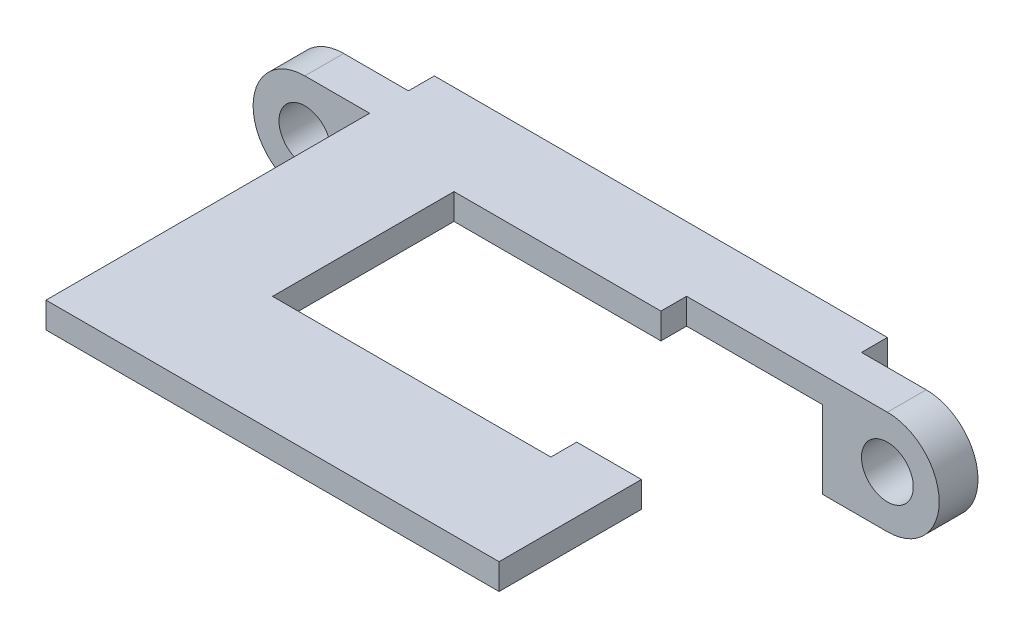
ISO-10303-21;
HEADER;
FILE_DESCRIPTION(('STEP AP214'),'2;1');
FILE_NAME('part.step','',(''),(''),'','','');
FILE_SCHEMA(('AUTOMOTIVE_DESIGN { 1 0 10303 214 1 1 1 1 }'));
ENDSEC;
DATA;
#1=APPLICATION_CONTEXT('core data for automotive mechanical design processes');
#2=APPLICATION_PROTOCOL_DEFINITION('international standard','automotive_design',2000,#1);
#3=PRODUCT_CONTEXT('',#1,'mechanical');
#4=PRODUCT('Part','Part','',(#3));
#5=PRODUCT_RELATED_PRODUCT_CATEGORY('part','',(#4));
#6=PRODUCT_DEFINITION_FORMATION('','',#4);
#7=PRODUCT_DEFINITION_CONTEXT('part definition',#1,'design');
#8=PRODUCT_DEFINITION('design','',#6,#7);
#9=PRODUCT_DEFINITION_SHAPE('','',#8);
#10=(LENGTH_UNIT() NAMED_UNIT(*) SI_UNIT(.MILLI.,.METRE.));
#11=(NAMED_UNIT(*) PLANE_ANGLE_UNIT() SI_UNIT($,.RADIAN.));
#12=(NAMED_UNIT(*) SI_UNIT($,.STERADIAN.) SOLID_ANGLE_UNIT());
#13=UNCERTAINTY_MEASURE_WITH_UNIT(LENGTH_MEASURE(1.E-05),#10,'distance_accuracy_value','');
#14=(GEOMETRIC_REPRESENTATION_CONTEXT(3) GLOBAL_UNCERTAINTY_ASSIGNED_CONTEXT((#13)) GLOBAL_UNIT_ASSIGNED_CONTEXT((#10,
#11,#12)) REPRESENTATION_CONTEXT('',''));
#15=CARTESIAN_POINT('',(0.,0.,0.));
#16=DIRECTION('',(0.,0.,1.));
#17=DIRECTION('',(1.,0.,0.));
#18=AXIS2_PLACEMENT_3D('',#15,#16,#17);
#19=CARTESIAN_POINT('',(-17.5,2.,5.));
#20=DIRECTION('',(1.,0.,0.));
#21=DIRECTION('',(0.,0.,-1.));
#22=AXIS2_PLACEMENT_3D('',#19,#20,#21);
#23=PLANE('',#22);
#24=DIRECTION('',(0.,-1.,0.));
#25=VECTOR('',#24,1.);
#26=CARTESIAN_POINT('',(-17.4999999999841,-291597.9,-13.));
#27=LINE('',#26,#25);
#28=CARTESIAN_POINT('',(-17.4999999999841,2.00000000000955,-13.));
#29=VERTEX_POINT('',#28);
#30=CARTESIAN_POINT('',(-17.4999999999841,0.,-13.));
#31=VERTEX_POINT('',#30);
#32=EDGE_CURVE('E201',#29,#31,#27,.T.);
#33=ORIENTED_EDGE('',*,*,#32,.F.);
#34=DIRECTION('',(0.,0.,1.));
#35=VECTOR('',#34,1.);
#36=CARTESIAN_POINT('',(-17.5,2.,-15.));
#37=LINE('',#36,#35);
#38=CARTESIAN_POINT('',(-17.5,2.,-15.));
#39=VERTEX_POINT('',#38);
#40=EDGE_CURVE('E275',#39,#29,#37,.T.);
#41=ORIENTED_EDGE('',*,*,#40,.F.);
#42=DIRECTION('',(0.,-1.,0.));
#43=VECTOR('',#42,1.);
#44=CARTESIAN_POINT('',(-17.5,2.,-15.));
#45=LINE('',#44,#43);
#46=CARTESIAN_POINT('',(-17.5,0.,-15.));
#47=VERTEX_POINT('',#46);
#48=EDGE_CURVE('E314',#39,#47,#45,.T.);
#49=ORIENTED_EDGE('',*,*,#48,.T.);
#50=DIRECTION('',(0.,0.,1.));
#51=VECTOR('',#50,1.);
#52=CARTESIAN_POINT('',(-17.5,0.,5.));
#53=LINE('',#52,#51);
#54=EDGE_CURVE('E303',#47,#31,#53,.T.);
#55=ORIENTED_EDGE('',*,*,#54,.T.);
#56=EDGE_LOOP('',(#33,#41,#49,#55));
#57=FACE_BOUND('',#56,.T.);
#58=ADVANCED_FACE('F34',(#57),#23,.F.);
#59=CARTESIAN_POINT('',(17.5,2.,6.));
#60=DIRECTION('',(-1.,0.,0.));
#61=DIRECTION('',(0.,0.,1.));
#62=AXIS2_PLACEMENT_3D('',#59,#60,#61);
#63=PLANE('',#62);
#64=DIRECTION('',(0.,0.,-1.));
#65=VECTOR('',#64,1.);
#66=CARTESIAN_POINT('',(17.5,0.,6.));
#67=LINE('',#66,#65);
#68=CARTESIAN_POINT('',(17.5,0.,15.));
#69=VERTEX_POINT('',#68);
#70=CARTESIAN_POINT('',(17.5,0.,4.));
#71=VERTEX_POINT('',#70);
#72=EDGE_CURVE('E250',#69,#71,#67,.T.);
#73=ORIENTED_EDGE('',*,*,#72,.T.);
#74=DIRECTION('',(0.,-1.,0.));
#75=VECTOR('',#74,1.);
#76=CARTESIAN_POINT('',(17.5,2.,4.));
#77=LINE('',#76,#75);
#78=CARTESIAN_POINT('',(17.5,2.,4.));
#79=VERTEX_POINT('',#78);
#80=EDGE_CURVE('E11',#79,#71,#77,.T.);
#81=ORIENTED_EDGE('',*,*,#80,.F.);
#82=DIRECTION('',(0.,0.,-1.));
#83=VECTOR('',#82,1.);
#84=CARTESIAN_POINT('',(17.5,2.,6.));
#85=LINE('',#84,#83);
#86=CARTESIAN_POINT('',(17.5,2.,15.));
#87=VERTEX_POINT('',#86);
#88=EDGE_CURVE('E254',#87,#79,#85,.T.);
#89=ORIENTED_EDGE('',*,*,#88,.F.);
#90=DIRECTION('',(0.,-1.,0.));
#91=VECTOR('',#90,1.);
#92=CARTESIAN_POINT('',(17.5,2.,15.));
#93=LINE('',#92,#91);
#94=EDGE_CURVE('E279',#87,#69,#93,.T.);
#95=ORIENTED_EDGE('',*,*,#94,.T.);
#96=EDGE_LOOP('',(#73,#81,#89,#95));
#97=FACE_BOUND('',#96,.T.);
#98=ADVANCED_FACE('F36',(#97),#63,.F.);
#99=CARTESIAN_POINT('',(17.5,2.,4.));
#100=DIRECTION('',(0.,0.,1.));
#101=DIRECTION('',(1.,0.,0.));
#102=AXIS2_PLACEMENT_3D('',#99,#100,#101);
#103=PLANE('',#102);
#104=DIRECTION('',(-1.,0.,0.));
#105=VECTOR('',#104,1.);
#106=CARTESIAN_POINT('',(17.5,0.,4.));
#107=LINE('',#106,#105);
#108=CARTESIAN_POINT('',(12.5,0.,4.));
#109=VERTEX_POINT('',#108);
#110=EDGE_CURVE('E281',#71,#109,#107,.T.);
#111=ORIENTED_EDGE('',*,*,#110,.T.);
#112=DIRECTION('',(0.,-1.,0.));
#113=VECTOR('',#112,1.);
#114=CARTESIAN_POINT('',(12.5,2.,4.));
#115=LINE('',#114,#113);
#116=CARTESIAN_POINT('',(12.5,2.,4.));
#117=VERTEX_POINT('',#116);
#118=EDGE_CURVE('E42',#117,#109,#115,.T.);
#119=ORIENTED_EDGE('',*,*,#118,.F.);
#120=DIRECTION('',(-1.,0.,0.));
#121=VECTOR('',#120,1.);
#122=CARTESIAN_POINT('',(17.5,2.,4.));
#123=LINE('',#122,#121);
#124=EDGE_CURVE('E256',#79,#117,#123,.T.);
#125=ORIENTED_EDGE('',*,*,#124,.F.);
#126=ORIENTED_EDGE('',*,*,#80,.T.);
#127=EDGE_LOOP('',(#111,#119,#125,#126));
#128=FACE_BOUND('',#127,.T.);
#129=ADVANCED_FACE('F361',(#128),#103,.F.);
#130=CARTESIAN_POINT('',(12.5,2.,4.));
#131=DIRECTION('',(1.,0.,0.));
#132=DIRECTION('',(0.,0.,-1.));
#133=AXIS2_PLACEMENT_3D('',#130,#131,#132);
#134=PLANE('',#133);
#135=DIRECTION('',(0.,0.,1.));
#136=VECTOR('',#135,1.);
#137=CARTESIAN_POINT('',(12.5,0.,4.));
#138=LINE('',#137,#136);
#139=CARTESIAN_POINT('',(12.5,0.,6.));
#140=VERTEX_POINT('',#139);
#141=EDGE_CURVE('E283',#109,#140,#138,.T.);
#142=ORIENTED_EDGE('',*,*,#141,.T.);
#143=DIRECTION('',(0.,-1.,0.));
#144=VECTOR('',#143,1.);
#145=CARTESIAN_POINT('',(12.5,2.,6.));
#146=LINE('',#145,#144);
#147=CARTESIAN_POINT('',(12.5,2.,6.));
#148=VERTEX_POINT('',#147);
#149=EDGE_CURVE('E332',#148,#140,#146,.T.);
#150=ORIENTED_EDGE('',*,*,#149,.F.);
#151=DIRECTION('',(0.,0.,1.));
#152=VECTOR('',#151,1.);
#153=CARTESIAN_POINT('',(12.5,2.,4.));
#154=LINE('',#153,#152);
#155=EDGE_CURVE('E259',#117,#148,#154,.T.);
#156=ORIENTED_EDGE('',*,*,#155,.F.);
#157=ORIENTED_EDGE('',*,*,#118,.T.);
#158=EDGE_LOOP('',(#142,#150,#156,#157));
#159=FACE_BOUND('',#158,.T.);
#160=ADVANCED_FACE('F339',(#159),#134,.F.);
#161=CARTESIAN_POINT('',(-8.99999999999999,2.,6.));
#162=DIRECTION('',(0.,0.,1.));
#163=DIRECTION('',(1.,0.,0.));
#164=AXIS2_PLACEMENT_3D('',#161,#162,#163);
#165=PLANE('',#164);
#166=DIRECTION('',(-1.,0.,0.));
#167=VECTOR('',#166,1.);
#168=CARTESIAN_POINT('',(-8.99999999999999,0.,6.));
#169=LINE('',#168,#167);
#170=CARTESIAN_POINT('',(-8.99999999999999,0.,6.));
#171=VERTEX_POINT('',#170);
#172=EDGE_CURVE('E285',#140,#171,#169,.T.);
#173=ORIENTED_EDGE('',*,*,#172,.T.);
#174=DIRECTION('',(0.,-1.,0.));
#175=VECTOR('',#174,1.);
#176=CARTESIAN_POINT('',(-8.99999999999999,2.,6.));
#177=LINE('',#176,#175);
#178=CARTESIAN_POINT('',(-8.99999999999999,2.,6.));
#179=VERTEX_POINT('',#178);
#180=EDGE_CURVE('E329',#179,#171,#177,.T.);
#181=ORIENTED_EDGE('',*,*,#180,.F.);
#182=DIRECTION('',(-1.,0.,0.));
#183=VECTOR('',#182,1.);
#184=CARTESIAN_POINT('',(-8.99999999999999,2.,6.));
#185=LINE('',#184,#183);
#186=EDGE_CURVE('E261',#148,#179,#185,.T.);
#187=ORIENTED_EDGE('',*,*,#186,.F.);
#188=ORIENTED_EDGE('',*,*,#149,.T.);
#189=EDGE_LOOP('',(#173,#181,#187,#188));
#190=FACE_BOUND('',#189,.T.);
#191=ADVANCED_FACE('F351',(#190),#165,.F.);
#192=CARTESIAN_POINT('',(-9.,2.,-8.01971875506438));
#193=DIRECTION('',(-1.,0.,0.));
#194=DIRECTION('',(0.,0.,1.));
#195=AXIS2_PLACEMENT_3D('',#192,#193,#194);
#196=PLANE('',#195);
#197=DIRECTION('',(0.,0.,-1.));
#198=VECTOR('',#197,1.);
#199=CARTESIAN_POINT('',(-9.,0.,-8.01971875506438));
#200=LINE('',#199,#198);
#201=CARTESIAN_POINT('',(-9.,0.,-8.01971875506438));
#202=VERTEX_POINT('',#201);
#203=EDGE_CURVE('E287',#171,#202,#200,.T.);
#204=ORIENTED_EDGE('',*,*,#203,.T.);
#205=DIRECTION('',(0.,-1.,0.));
#206=VECTOR('',#205,1.);
#207=CARTESIAN_POINT('',(-9.,2.,-8.01971875506438));
#208=LINE('',#207,#206);
#209=CARTESIAN_POINT('',(-9.,2.,-8.01971875506438));
#210=VERTEX_POINT('',#209);
#211=EDGE_CURVE('E326',#210,#202,#208,.T.);
#212=ORIENTED_EDGE('',*,*,#211,.F.);
#213=DIRECTION('',(0.,0.,-1.));
#214=VECTOR('',#213,1.);
#215=CARTESIAN_POINT('',(-9.,2.,-8.01971875506438));
#216=LINE('',#215,#214);
#217=EDGE_CURVE('E263',#179,#210,#216,.T.);
#218=ORIENTED_EDGE('',*,*,#217,.F.);
#219=ORIENTED_EDGE('',*,*,#180,.T.);
#220=EDGE_LOOP('',(#204,#212,#218,#219));
#221=FACE_BOUND('',#220,.T.);
#222=ADVANCED_FACE('F355',(#221),#196,.F.);
#223=CARTESIAN_POINT('',(6.98688159725857,2.,-8.01971875506438));
#224=DIRECTION('',(0.,0.,-1.));
#225=DIRECTION('',(-1.,0.,0.));
#226=AXIS2_PLACEMENT_3D('',#223,#224,#225);
#227=PLANE('',#226);
#228=DIRECTION('',(1.,0.,0.));
#229=VECTOR('',#228,1.);
#230=CARTESIAN_POINT('',(6.98688159725857,0.,-8.01971875506438));
#231=LINE('',#230,#229);
#232=CARTESIAN_POINT('',(6.98688159725857,0.,-8.01971875506438));
#233=VERTEX_POINT('',#232);
#234=EDGE_CURVE('E289',#202,#233,#231,.T.);
#235=ORIENTED_EDGE('',*,*,#234,.T.);
#236=DIRECTION('',(0.,-1.,0.));
#237=VECTOR('',#236,1.);
#238=CARTESIAN_POINT('',(6.98688159725857,2.,-8.01971875506438));
#239=LINE('',#238,#237);
#240=CARTESIAN_POINT('',(6.98688159725857,2.,-8.01971875506438));
#241=VERTEX_POINT('',#240);
#242=EDGE_CURVE('E323',#241,#233,#239,.T.);
#243=ORIENTED_EDGE('',*,*,#242,.F.);
#244=DIRECTION('',(1.,0.,0.));
#245=VECTOR('',#244,1.);
#246=CARTESIAN_POINT('',(6.98688159725857,2.,-8.01971875506438));
#247=LINE('',#246,#245);
#248=EDGE_CURVE('E265',#210,#241,#247,.T.);
#249=ORIENTED_EDGE('',*,*,#248,.F.);
#250=ORIENTED_EDGE('',*,*,#211,.T.);
#251=EDGE_LOOP('',(#235,#243,#249,#250));
#252=FACE_BOUND('',#251,.T.);
#253=ADVANCED_FACE('F410',(#252),#227,.F.);
#254=CARTESIAN_POINT('',(6.98688159725857,2.,-10.));
#255=DIRECTION('',(-1.,0.,0.));
#256=DIRECTION('',(0.,0.,1.));
#257=AXIS2_PLACEMENT_3D('',#254,#255,#256);
#258=PLANE('',#257);
#259=DIRECTION('',(0.,0.,-1.));
#260=VECTOR('',#259,1.);
#261=CARTESIAN_POINT('',(6.98688159725857,0.,-10.));
#262=LINE('',#261,#260);
#263=CARTESIAN_POINT('',(6.98688159725857,0.,-10.));
#264=VERTEX_POINT('',#263);
#265=EDGE_CURVE('E291',#233,#264,#262,.T.);
#266=ORIENTED_EDGE('',*,*,#265,.T.);
#267=DIRECTION('',(0.,-1.,0.));
#268=VECTOR('',#267,1.);
#269=CARTESIAN_POINT('',(6.98688159725857,2.,-10.));
#270=LINE('',#269,#268);
#271=CARTESIAN_POINT('',(6.98688159725857,2.,-10.));
#272=VERTEX_POINT('',#271);
#273=EDGE_CURVE('E320',#272,#264,#270,.T.);
#274=ORIENTED_EDGE('',*,*,#273,.F.);
#275=DIRECTION('',(0.,0.,-1.));
#276=VECTOR('',#275,1.);
#277=CARTESIAN_POINT('',(6.98688159725857,2.,-10.));
#278=LINE('',#277,#276);
#279=EDGE_CURVE('E267',#241,#272,#278,.T.);
#280=ORIENTED_EDGE('',*,*,#279,.F.);
#281=ORIENTED_EDGE('',*,*,#242,.T.);
#282=EDGE_LOOP('',(#266,#274,#280,#281));
#283=FACE_BOUND('',#282,.T.);
#284=ADVANCED_FACE('F407',(#283),#258,.F.);
#285=CARTESIAN_POINT('',(17.5,2.,-10.));
#286=DIRECTION('',(0.,0.,-1.));
#287=DIRECTION('',(-1.,0.,0.));
#288=AXIS2_PLACEMENT_3D('',#285,#286,#287);
#289=PLANE('',#288);
#290=DIRECTION('',(1.,0.,0.));
#291=VECTOR('',#290,1.);
#292=CARTESIAN_POINT('',(17.5,0.,-10.));
#293=LINE('',#292,#291);
#294=CARTESIAN_POINT('',(17.5,0.,-10.));
#295=VERTEX_POINT('',#294);
#296=EDGE_CURVE('E293',#264,#295,#293,.T.);
#297=ORIENTED_EDGE('',*,*,#296,.T.);
#298=DIRECTION('',(0.,1.,0.));
#299=VECTOR('',#298,1.);
#300=CARTESIAN_POINT('',(17.4999999999841,-291597.9,-10.));
#301=LINE('',#300,#299);
#302=CARTESIAN_POINT('',(17.4999999999841,-5.99999999995926,-10.));
#303=VERTEX_POINT('',#302);
#304=EDGE_CURVE('E226',#303,#295,#301,.T.);
#305=ORIENTED_EDGE('',*,*,#304,.F.);
#306=DIRECTION('',(-1.,0.,0.));
#307=VECTOR('',#306,1.);
#308=CARTESIAN_POINT('',(400000.,-6.00000000002865,-10.));
#309=LINE('',#308,#307);
#310=CARTESIAN_POINT('',(22.4999999999795,-5.99999999995926,-10.));
#311=VERTEX_POINT('',#310);
#312=EDGE_CURVE('E233',#311,#303,#309,.T.);
#313=ORIENTED_EDGE('',*,*,#312,.F.);
#314=CARTESIAN_POINT('',(22.5,-2.,-10.));
#315=DIRECTION('',(0.,0.,-1.));
#316=DIRECTION('',(-1.,0.,0.));
#317=AXIS2_PLACEMENT_3D('',#314,#315,#316);
#318=CIRCLE('',#317,4.);
#319=CARTESIAN_POINT('',(22.5000000000364,2.,-10.));
#320=VERTEX_POINT('',#319);
#321=EDGE_CURVE('E229',#320,#311,#318,.T.);
#322=ORIENTED_EDGE('',*,*,#321,.F.);
#323=DIRECTION('',(1.,0.,0.));
#324=VECTOR('',#323,1.);
#325=CARTESIAN_POINT('',(17.5,2.,-10.));
#326=LINE('',#325,#324);
#327=EDGE_CURVE('E269',#272,#320,#326,.T.);
#328=ORIENTED_EDGE('',*,*,#327,.F.);
#329=ORIENTED_EDGE('',*,*,#273,.T.);
#330=EDGE_LOOP('',(#297,#305,#313,#322,#328,#329));
#331=FACE_BOUND('',#330,.T.);
#332=CARTESIAN_POINT('',(22.5,-2.,-10.));
#333=DIRECTION('',(0.,0.,-1.));
#334=DIRECTION('',(-1.,0.,0.));
#335=AXIS2_PLACEMENT_3D('',#332,#333,#334);
#336=CIRCLE('',#335,2.);
#337=CARTESIAN_POINT('',(20.5,-2.,-10.));
#338=VERTEX_POINT('',#337);
#339=EDGE_CURVE('E220',#338,#338,#336,.T.);
#340=ORIENTED_EDGE('',*,*,#339,.T.);
#341=EDGE_LOOP('',(#340));
#342=FACE_BOUND('',#341,.T.);
#343=ADVANCED_FACE('F400',(#331,#342),#289,.F.);
#344=CARTESIAN_POINT('',(17.5,2.,-15.));
#345=DIRECTION('',(-1.,0.,0.));
#346=DIRECTION('',(0.,0.,1.));
#347=AXIS2_PLACEMENT_3D('',#344,#345,#346);
#348=PLANE('',#347);
#349=DIRECTION('',(0.,0.,-1.));
#350=VECTOR('',#349,1.);
#351=CARTESIAN_POINT('',(17.5,2.,-15.));
#352=LINE('',#351,#350);
#353=CARTESIAN_POINT('',(17.5,2.,-13.));
#354=VERTEX_POINT('',#353);
#355=CARTESIAN_POINT('',(17.5,2.,-15.));
#356=VERTEX_POINT('',#355);
#357=EDGE_CURVE('E57',#354,#356,#352,.T.);
#358=ORIENTED_EDGE('',*,*,#357,.F.);
#359=DIRECTION('',(0.,1.,0.));
#360=VECTOR('',#359,1.);
#361=CARTESIAN_POINT('',(17.4999999999841,-291597.9,-13.));
#362=LINE('',#361,#360);
#363=CARTESIAN_POINT('',(17.4999999999841,0.,-13.));
#364=VERTEX_POINT('',#363);
#365=EDGE_CURVE('E223',#364,#354,#362,.T.);
#366=ORIENTED_EDGE('',*,*,#365,.F.);
#367=DIRECTION('',(0.,0.,-1.));
#368=VECTOR('',#367,1.);
#369=CARTESIAN_POINT('',(17.5,0.,-15.));
#370=LINE('',#369,#368);
#371=CARTESIAN_POINT('',(17.5,0.,-15.));
#372=VERTEX_POINT('',#371);
#373=EDGE_CURVE('E295',#364,#372,#370,.T.);
#374=ORIENTED_EDGE('',*,*,#373,.T.);
#375=DIRECTION('',(0.,-1.,0.));
#376=VECTOR('',#375,1.);
#377=CARTESIAN_POINT('',(17.5,2.,-15.));
#378=LINE('',#377,#376);
#379=EDGE_CURVE('E317',#356,#372,#378,.T.);
#380=ORIENTED_EDGE('',*,*,#379,.F.);
#381=EDGE_LOOP('',(#358,#366,#374,#380));
#382=FACE_BOUND('',#381,.T.);
#383=ADVANCED_FACE('F386',(#382),#348,.F.);
#384=CARTESIAN_POINT('',(-17.5,2.,-15.));
#385=DIRECTION('',(0.,0.,1.));
#386=DIRECTION('',(1.,0.,0.));
#387=AXIS2_PLACEMENT_3D('',#384,#385,#386);
#388=PLANE('',#387);
#389=DIRECTION('',(-1.,0.,0.));
#390=VECTOR('',#389,1.);
#391=CARTESIAN_POINT('',(-17.5,0.,-15.));
#392=LINE('',#391,#390);
#393=EDGE_CURVE('E299',#372,#47,#392,.T.);
#394=ORIENTED_EDGE('',*,*,#393,.T.);
#395=ORIENTED_EDGE('',*,*,#48,.F.);
#396=DIRECTION('',(-1.,0.,0.));
#397=VECTOR('',#396,1.);
#398=CARTESIAN_POINT('',(5.,2.,-15.));
#399=LINE('',#398,#397);
#400=EDGE_CURVE('E272',#356,#39,#399,.T.);
#401=ORIENTED_EDGE('',*,*,#400,.F.);
#402=ORIENTED_EDGE('',*,*,#379,.T.);
#403=EDGE_LOOP('',(#394,#395,#401,#402));
#404=FACE_BOUND('',#403,.T.);
#405=ADVANCED_FACE('F383',(#404),#388,.F.);
#406=CARTESIAN_POINT('',(-17.4999999999841,2.00000000000955,-10.));
#407=VERTEX_POINT('',#406);
#408=CARTESIAN_POINT('',(-17.5,2.,15.));
#409=VERTEX_POINT('',#408);
#410=EDGE_CURVE('E274',#407,#409,#37,.T.);
#411=ORIENTED_EDGE('',*,*,#410,.F.);
#412=DIRECTION('',(0.,-1.,0.));
#413=VECTOR('',#412,1.);
#414=CARTESIAN_POINT('',(-17.4999999999841,-291597.9,-10.));
#415=LINE('',#414,#413);
#416=CARTESIAN_POINT('',(-17.5,0.,-10.));
#417=VERTEX_POINT('',#416);
#418=EDGE_CURVE('E194',#407,#417,#415,.T.);
#419=ORIENTED_EDGE('',*,*,#418,.T.);
#420=CARTESIAN_POINT('',(-17.5,0.,15.));
#421=VERTEX_POINT('',#420);
#422=EDGE_CURVE('E302',#417,#421,#53,.T.);
#423=ORIENTED_EDGE('',*,*,#422,.T.);
#424=DIRECTION('',(0.,-1.,0.));
#425=VECTOR('',#424,1.);
#426=CARTESIAN_POINT('',(-17.5,2.,15.));
#427=LINE('',#426,#425);
#428=EDGE_CURVE('E311',#409,#421,#427,.T.);
#429=ORIENTED_EDGE('',*,*,#428,.F.);
#430=EDGE_LOOP('',(#411,#419,#423,#429));
#431=FACE_BOUND('',#430,.T.);
#432=ADVANCED_FACE('F371',(#431),#23,.F.);
#433=CARTESIAN_POINT('',(-17.5,2.,15.));
#434=DIRECTION('',(0.,0.,-1.));
#435=DIRECTION('',(-1.,0.,0.));
#436=AXIS2_PLACEMENT_3D('',#433,#434,#435);
#437=PLANE('',#436);
#438=DIRECTION('',(1.,0.,0.));
#439=VECTOR('',#438,1.);
#440=CARTESIAN_POINT('',(-17.5,0.,15.));
#441=LINE('',#440,#439);
#442=EDGE_CURVE('E257',#421,#69,#441,.T.);
#443=ORIENTED_EDGE('',*,*,#442,.T.);
#444=ORIENTED_EDGE('',*,*,#94,.F.);
#445=DIRECTION('',(1.,0.,0.));
#446=VECTOR('',#445,1.);
#447=CARTESIAN_POINT('',(-17.5,2.,15.));
#448=LINE('',#447,#446);
#449=EDGE_CURVE('E277',#409,#87,#448,.T.);
#450=ORIENTED_EDGE('',*,*,#449,.F.);
#451=ORIENTED_EDGE('',*,*,#428,.T.);
#452=EDGE_LOOP('',(#443,#444,#450,#451));
#453=FACE_BOUND('',#452,.T.);
#454=ADVANCED_FACE('F367',(#453),#437,.F.);
#455=CARTESIAN_POINT('',(0.,2.,0.));
#456=DIRECTION('',(0.,1.,0.));
#457=DIRECTION('',(0.,0.,1.));
#458=AXIS2_PLACEMENT_3D('',#455,#456,#457);
#459=PLANE('',#458);
#460=ORIENTED_EDGE('',*,*,#88,.T.);
#461=ORIENTED_EDGE('',*,*,#124,.T.);
#462=ORIENTED_EDGE('',*,*,#155,.T.);
#463=ORIENTED_EDGE('',*,*,#186,.T.);
#464=ORIENTED_EDGE('',*,*,#217,.T.);
#465=ORIENTED_EDGE('',*,*,#248,.T.);
#466=ORIENTED_EDGE('',*,*,#279,.T.);
#467=ORIENTED_EDGE('',*,*,#327,.T.);
#468=DIRECTION('',(0.,0.,-1.));
#469=VECTOR('',#468,1.);
#470=CARTESIAN_POINT('',(22.5000000000364,2.,-10.));
#471=LINE('',#470,#469);
#472=CARTESIAN_POINT('',(22.5000000000364,2.,-13.));
#473=VERTEX_POINT('',#472);
#474=EDGE_CURVE('E236',#320,#473,#471,.T.);
#475=ORIENTED_EDGE('',*,*,#474,.T.);
#476=DIRECTION('',(1.,0.,0.));
#477=VECTOR('',#476,1.);
#478=CARTESIAN_POINT('',(400000.,1.99999999995271,-13.));
#479=LINE('',#478,#477);
#480=EDGE_CURVE('E240',#354,#473,#479,.T.);
#481=ORIENTED_EDGE('',*,*,#480,.F.);
#482=ORIENTED_EDGE('',*,*,#357,.T.);
#483=ORIENTED_EDGE('',*,*,#400,.T.);
#484=ORIENTED_EDGE('',*,*,#40,.T.);
#485=DIRECTION('',(1.,0.,0.));
#486=VECTOR('',#485,1.);
#487=CARTESIAN_POINT('',(400000.000000001,1.99999999932743,-13.));
#488=LINE('',#487,#486);
#489=CARTESIAN_POINT('',(-22.4999999999795,2.00000000002136,-13.));
#490=VERTEX_POINT('',#489);
#491=EDGE_CURVE('E181',#490,#29,#488,.T.);
#492=ORIENTED_EDGE('',*,*,#491,.F.);
#493=DIRECTION('',(0.,0.,-1.));
#494=VECTOR('',#493,1.);
#495=CARTESIAN_POINT('',(-22.4999999999795,2.00000000002136,-10.));
#496=LINE('',#495,#494);
#497=CARTESIAN_POINT('',(-22.4999999999795,2.00000000002136,-10.));
#498=VERTEX_POINT('',#497);
#499=EDGE_CURVE('E175',#498,#490,#496,.T.);
#500=ORIENTED_EDGE('',*,*,#499,.F.);
#501=DIRECTION('',(1.,0.,0.));
#502=VECTOR('',#501,1.);
#503=CARTESIAN_POINT('',(400000.000000001,1.99999999932743,-10.));
#504=LINE('',#503,#502);
#505=EDGE_CURVE('E178',#498,#407,#504,.T.);
#506=ORIENTED_EDGE('',*,*,#505,.T.);
#507=ORIENTED_EDGE('',*,*,#410,.T.);
#508=ORIENTED_EDGE('',*,*,#449,.T.);
#509=EDGE_LOOP('',(#460,#461,#462,#463,#464,#465,#466,#467,#475,#481,#482,#483,#484,#492,#500,
#506,#507,#508));
#510=FACE_BOUND('',#509,.T.);
#511=ADVANCED_FACE('F177',(#510),#459,.T.);
#512=CARTESIAN_POINT('',(0.,0.,0.));
#513=DIRECTION('',(0.,1.,0.));
#514=DIRECTION('',(0.,0.,1.));
#515=AXIS2_PLACEMENT_3D('',#512,#513,#514);
#516=PLANE('',#515);
#517=ORIENTED_EDGE('',*,*,#72,.F.);
#518=ORIENTED_EDGE('',*,*,#442,.F.);
#519=ORIENTED_EDGE('',*,*,#422,.F.);
#520=EDGE_CURVE('E306',#31,#417,#53,.T.);
#521=ORIENTED_EDGE('',*,*,#520,.F.);
#522=ORIENTED_EDGE('',*,*,#54,.F.);
#523=ORIENTED_EDGE('',*,*,#393,.F.);
#524=ORIENTED_EDGE('',*,*,#373,.F.);
#525=EDGE_CURVE('E296',#295,#364,#370,.T.);
#526=ORIENTED_EDGE('',*,*,#525,.F.);
#527=ORIENTED_EDGE('',*,*,#296,.F.);
#528=ORIENTED_EDGE('',*,*,#265,.F.);
#529=ORIENTED_EDGE('',*,*,#234,.F.);
#530=ORIENTED_EDGE('',*,*,#203,.F.);
#531=ORIENTED_EDGE('',*,*,#172,.F.);
#532=ORIENTED_EDGE('',*,*,#141,.F.);
#533=ORIENTED_EDGE('',*,*,#110,.F.);
#534=EDGE_LOOP('',(#517,#518,#519,#521,#522,#523,#524,#526,#527,#528,#529,#530,#531,#532,#533));
#535=FACE_BOUND('',#534,.T.);
#536=ADVANCED_FACE('F346',(#535),#516,.F.);
#537=CARTESIAN_POINT('',(17.4999999999841,-291597.9,-10.));
#538=DIRECTION('',(-1.,0.,0.));
#539=DIRECTION('',(0.,0.,1.));
#540=AXIS2_PLACEMENT_3D('',#537,#538,#539);
#541=PLANE('',#540);
#542=ORIENTED_EDGE('',*,*,#525,.T.);
#543=CARTESIAN_POINT('',(17.4999999999841,-5.99999999995926,-13.));
#544=VERTEX_POINT('',#543);
#545=EDGE_CURVE('E237',#544,#364,#362,.T.);
#546=ORIENTED_EDGE('',*,*,#545,.F.);
#547=DIRECTION('',(0.,0.,-1.));
#548=VECTOR('',#547,1.);
#549=CARTESIAN_POINT('',(17.4999999999841,-5.99999999995926,-10.));
#550=LINE('',#549,#548);
#551=EDGE_CURVE('E248',#303,#544,#550,.T.);
#552=ORIENTED_EDGE('',*,*,#551,.F.);
#553=ORIENTED_EDGE('',*,*,#304,.T.);
#554=EDGE_LOOP('',(#542,#546,#552,#553));
#555=FACE_BOUND('',#554,.T.);
#556=ADVANCED_FACE('F391',(#555),#541,.T.);
#557=CARTESIAN_POINT('',(400000.,-6.00000000002865,-10.));
#558=DIRECTION('',(0.,-1.,0.));
#559=DIRECTION('',(1.,0.,0.));
#560=AXIS2_PLACEMENT_3D('',#557,#558,#559);
#561=PLANE('',#560);
#562=DIRECTION('',(-1.,0.,0.));
#563=VECTOR('',#562,1.);
#564=CARTESIAN_POINT('',(400000.,-6.00000000002865,-13.));
#565=LINE('',#564,#563);
#566=CARTESIAN_POINT('',(22.4999999999795,-5.99999999995926,-13.));
#567=VERTEX_POINT('',#566);
#568=EDGE_CURVE('E230',#567,#544,#565,.T.);
#569=ORIENTED_EDGE('',*,*,#568,.F.);
#570=DIRECTION('',(0.,0.,-1.));
#571=VECTOR('',#570,1.);
#572=CARTESIAN_POINT('',(22.4999999999795,-5.99999999995926,-10.));
#573=LINE('',#572,#571);
#574=EDGE_CURVE('E251',#311,#567,#573,.T.);
#575=ORIENTED_EDGE('',*,*,#574,.F.);
#576=ORIENTED_EDGE('',*,*,#312,.T.);
#577=ORIENTED_EDGE('',*,*,#551,.T.);
#578=EDGE_LOOP('',(#569,#575,#576,#577));
#579=FACE_BOUND('',#578,.T.);
#580=ADVANCED_FACE('F397',(#579),#561,.T.);
#581=CARTESIAN_POINT('',(22.5,-2.,-10.));
#582=DIRECTION('',(0.,0.,-1.));
#583=DIRECTION('',(-1.,0.,0.));
#584=AXIS2_PLACEMENT_3D('',#581,#582,#583);
#585=CYLINDRICAL_SURFACE('',#584,4.);
#586=CARTESIAN_POINT('',(22.5,-2.,-13.));
#587=DIRECTION('',(0.,0.,-1.));
#588=DIRECTION('',(-1.,0.,0.));
#589=AXIS2_PLACEMENT_3D('',#586,#587,#588);
#590=CIRCLE('',#589,4.);
#591=EDGE_CURVE('E243',#473,#567,#590,.T.);
#592=ORIENTED_EDGE('',*,*,#591,.F.);
#593=ORIENTED_EDGE('',*,*,#474,.F.);
#594=ORIENTED_EDGE('',*,*,#321,.T.);
#595=ORIENTED_EDGE('',*,*,#574,.T.);
#596=EDGE_LOOP('',(#592,#593,#594,#595));
#597=FACE_BOUND('',#596,.T.);
#598=ADVANCED_FACE('F489',(#597),#585,.T.);
#599=CARTESIAN_POINT('',(22.5,-2.,-13.));
#600=DIRECTION('',(0.,0.,-1.));
#601=DIRECTION('',(-1.,0.,0.));
#602=AXIS2_PLACEMENT_3D('',#599,#600,#601);
#603=PLANE('',#602);
#604=CARTESIAN_POINT('',(22.5,-2.,-13.));
#605=DIRECTION('',(0.,0.,-1.));
#606=DIRECTION('',(-1.,0.,0.));
#607=AXIS2_PLACEMENT_3D('',#604,#605,#606);
#608=CIRCLE('',#607,2.);
#609=CARTESIAN_POINT('',(20.5,-2.,-13.));
#610=VERTEX_POINT('',#609);
#611=EDGE_CURVE('E217',#610,#610,#608,.T.);
#612=ORIENTED_EDGE('',*,*,#611,.F.);
#613=EDGE_LOOP('',(#612));
#614=FACE_BOUND('',#613,.T.);
#615=ORIENTED_EDGE('',*,*,#545,.T.);
#616=ORIENTED_EDGE('',*,*,#365,.T.);
#617=ORIENTED_EDGE('',*,*,#480,.T.);
#618=ORIENTED_EDGE('',*,*,#591,.T.);
#619=ORIENTED_EDGE('',*,*,#568,.T.);
#620=EDGE_LOOP('',(#615,#616,#617,#618,#619));
#621=FACE_BOUND('',#620,.T.);
#622=ADVANCED_FACE('F393',(#614,#621),#603,.T.);
#623=CARTESIAN_POINT('',(22.5,-2.,-10.));
#624=DIRECTION('',(0.,0.,-1.));
#625=DIRECTION('',(-1.,0.,0.));
#626=AXIS2_PLACEMENT_3D('',#623,#624,#625);
#627=CYLINDRICAL_SURFACE('',#626,2.);
#628=ORIENTED_EDGE('',*,*,#339,.F.);
#629=EDGE_LOOP('',(#628));
#630=FACE_BOUND('',#629,.T.);
#631=ORIENTED_EDGE('',*,*,#611,.T.);
#632=EDGE_LOOP('',(#631));
#633=FACE_BOUND('',#632,.T.);
#634=ADVANCED_FACE('F507',(#630,#633),#627,.F.);
#635=CARTESIAN_POINT('',(-22.5,-1.99999999999999,-10.));
#636=DIRECTION('',(0.,0.,-1.));
#637=DIRECTION('',(-1.,0.,0.));
#638=AXIS2_PLACEMENT_3D('',#635,#636,#637);
#639=CYLINDRICAL_SURFACE('',#638,4.);
#640=CARTESIAN_POINT('',(-22.5,-1.99999999999999,-13.));
#641=DIRECTION('',(0.,0.,-1.));
#642=DIRECTION('',(-1.,0.,0.));
#643=AXIS2_PLACEMENT_3D('',#640,#641,#642);
#644=CIRCLE('',#643,4.);
#645=CARTESIAN_POINT('',(-22.4999999999795,-5.99999999994671,-13.));
#646=VERTEX_POINT('',#645);
#647=EDGE_CURVE('E209',#646,#490,#644,.T.);
#648=ORIENTED_EDGE('',*,*,#647,.F.);
#649=DIRECTION('',(0.,0.,-1.));
#650=VECTOR('',#649,1.);
#651=CARTESIAN_POINT('',(-22.4999999999795,-5.99999999994671,-10.));
#652=LINE('',#651,#650);
#653=CARTESIAN_POINT('',(-22.4999999999795,-5.99999999994671,-10.));
#654=VERTEX_POINT('',#653);
#655=EDGE_CURVE('E197',#654,#646,#652,.T.);
#656=ORIENTED_EDGE('',*,*,#655,.F.);
#657=CARTESIAN_POINT('',(-22.5,-1.99999999999999,-10.));
#658=DIRECTION('',(0.,0.,-1.));
#659=DIRECTION('',(-1.,0.,0.));
#660=AXIS2_PLACEMENT_3D('',#657,#658,#659);
#661=CIRCLE('',#660,4.);
#662=EDGE_CURVE('E191',#654,#498,#661,.T.);
#663=ORIENTED_EDGE('',*,*,#662,.T.);
#664=ORIENTED_EDGE('',*,*,#499,.T.);
#665=EDGE_LOOP('',(#648,#656,#663,#664));
#666=FACE_BOUND('',#665,.T.);
#667=ADVANCED_FACE('F196',(#666),#639,.T.);
#668=CARTESIAN_POINT('',(400000.,-6.00000000008549,-10.));
#669=DIRECTION('',(0.,-1.,0.));
#670=DIRECTION('',(1.,0.,0.));
#671=AXIS2_PLACEMENT_3D('',#668,#669,#670);
#672=PLANE('',#671);
#673=DIRECTION('',(-1.,0.,0.));
#674=VECTOR('',#673,1.);
#675=CARTESIAN_POINT('',(400000.,-6.00000000008549,-13.));
#676=LINE('',#675,#674);
#677=CARTESIAN_POINT('',(-17.4999999999841,-5.99999999994671,-13.));
#678=VERTEX_POINT('',#677);
#679=EDGE_CURVE('E198',#678,#646,#676,.T.);
#680=ORIENTED_EDGE('',*,*,#679,.F.);
#681=DIRECTION('',(0.,0.,-1.));
#682=VECTOR('',#681,1.);
#683=CARTESIAN_POINT('',(-17.4999999999841,-5.99999999994671,-10.));
#684=LINE('',#683,#682);
#685=CARTESIAN_POINT('',(-17.4999999999841,-5.99999999994671,-10.));
#686=VERTEX_POINT('',#685);
#687=EDGE_CURVE('E186',#686,#678,#684,.T.);
#688=ORIENTED_EDGE('',*,*,#687,.F.);
#689=DIRECTION('',(-1.,0.,0.));
#690=VECTOR('',#689,1.);
#691=CARTESIAN_POINT('',(400000.,-6.00000000008549,-10.));
#692=LINE('',#691,#690);
#693=EDGE_CURVE('E187',#686,#654,#692,.T.);
#694=ORIENTED_EDGE('',*,*,#693,.T.);
#695=ORIENTED_EDGE('',*,*,#655,.T.);
#696=EDGE_LOOP('',(#680,#688,#694,#695));
#697=FACE_BOUND('',#696,.T.);
#698=ADVANCED_FACE('F526',(#697),#672,.T.);
#699=CARTESIAN_POINT('',(-17.4999999999841,-291597.9,-10.));
#700=DIRECTION('',(1.,0.,0.));
#701=DIRECTION('',(0.,0.,-1.));
#702=AXIS2_PLACEMENT_3D('',#699,#700,#701);
#703=PLANE('',#702);
#704=EDGE_CURVE('E213',#31,#678,#27,.T.);
#705=ORIENTED_EDGE('',*,*,#704,.F.);
#706=ORIENTED_EDGE('',*,*,#520,.T.);
#707=EDGE_CURVE('E49',#417,#686,#415,.T.);
#708=ORIENTED_EDGE('',*,*,#707,.T.);
#709=ORIENTED_EDGE('',*,*,#687,.T.);
#710=EDGE_LOOP('',(#705,#706,#708,#709));
#711=FACE_BOUND('',#710,.T.);
#712=ADVANCED_FACE('F374',(#711),#703,.T.);
#713=CARTESIAN_POINT('',(-22.5,-1.99999999999999,-10.));
#714=DIRECTION('',(0.,0.,-1.));
#715=DIRECTION('',(-1.,0.,0.));
#716=AXIS2_PLACEMENT_3D('',#713,#714,#715);
#717=PLANE('',#716);
#718=CARTESIAN_POINT('',(-22.5,-1.99999999999999,-10.));
#719=DIRECTION('',(0.,0.,-1.));
#720=DIRECTION('',(-1.,0.,0.));
#721=AXIS2_PLACEMENT_3D('',#718,#719,#720);
#722=CIRCLE('',#721,2.);
#723=CARTESIAN_POINT('',(-24.5,-1.99999999999999,-10.));
#724=VERTEX_POINT('',#723);
#725=EDGE_CURVE('E211',#724,#724,#722,.T.);
#726=ORIENTED_EDGE('',*,*,#725,.T.);
#727=EDGE_LOOP('',(#726));
#728=FACE_BOUND('',#727,.T.);
#729=ORIENTED_EDGE('',*,*,#662,.F.);
#730=ORIENTED_EDGE('',*,*,#693,.F.);
#731=ORIENTED_EDGE('',*,*,#707,.F.);
#732=ORIENTED_EDGE('',*,*,#418,.F.);
#733=ORIENTED_EDGE('',*,*,#505,.F.);
#734=EDGE_LOOP('',(#729,#730,#731,#732,#733));
#735=FACE_BOUND('',#734,.T.);
#736=ADVANCED_FACE('F190',(#728,#735),#717,.F.);
#737=CARTESIAN_POINT('',(-22.5,-1.99999999999999,-13.));
#738=DIRECTION('',(0.,0.,-1.));
#739=DIRECTION('',(-1.,0.,0.));
#740=AXIS2_PLACEMENT_3D('',#737,#738,#739);
#741=PLANE('',#740);
#742=CARTESIAN_POINT('',(-22.5,-1.99999999999999,-13.));
#743=DIRECTION('',(0.,0.,-1.));
#744=DIRECTION('',(-1.,0.,0.));
#745=AXIS2_PLACEMENT_3D('',#742,#743,#744);
#746=CIRCLE('',#745,2.);
#747=CARTESIAN_POINT('',(-24.5,-1.99999999999999,-13.));
#748=VERTEX_POINT('',#747);
#749=EDGE_CURVE('E204',#748,#748,#746,.T.);
#750=ORIENTED_EDGE('',*,*,#749,.F.);
#751=EDGE_LOOP('',(#750));
#752=FACE_BOUND('',#751,.T.);
#753=ORIENTED_EDGE('',*,*,#647,.T.);
#754=ORIENTED_EDGE('',*,*,#491,.T.);
#755=ORIENTED_EDGE('',*,*,#32,.T.);
#756=ORIENTED_EDGE('',*,*,#704,.T.);
#757=ORIENTED_EDGE('',*,*,#679,.T.);
#758=EDGE_LOOP('',(#753,#754,#755,#756,#757));
#759=FACE_BOUND('',#758,.T.);
#760=ADVANCED_FACE('F552',(#752,#759),#741,.T.);
#761=CARTESIAN_POINT('',(-22.5,-1.99999999999999,-10.));
#762=DIRECTION('',(0.,0.,-1.));
#763=DIRECTION('',(-1.,0.,0.));
#764=AXIS2_PLACEMENT_3D('',#761,#762,#763);
#765=CYLINDRICAL_SURFACE('',#764,2.);
#766=ORIENTED_EDGE('',*,*,#725,.F.);
#767=EDGE_LOOP('',(#766));
#768=FACE_BOUND('',#767,.T.);
#769=ORIENTED_EDGE('',*,*,#749,.T.);
#770=EDGE_LOOP('',(#769));
#771=FACE_BOUND('',#770,.T.);
#772=ADVANCED_FACE('F562',(#768,#771),#765,.F.);
#773=CLOSED_SHELL('',(#58,#98,#129,#160,#191,#222,#253,#284,#343,#383,#405,#432,#454,#511,#536,
#556,#580,#598,#622,#634,#667,#698,#712,#736,#760,#772));
#774=MANIFOLD_SOLID_BREP('B2',#773);
#775=ADVANCED_BREP_SHAPE_REPRESENTATION('',(#18,#774),#14);
#776=SHAPE_DEFINITION_REPRESENTATION(#9,#775);
ENDSEC;
END-ISO-10303-21;
